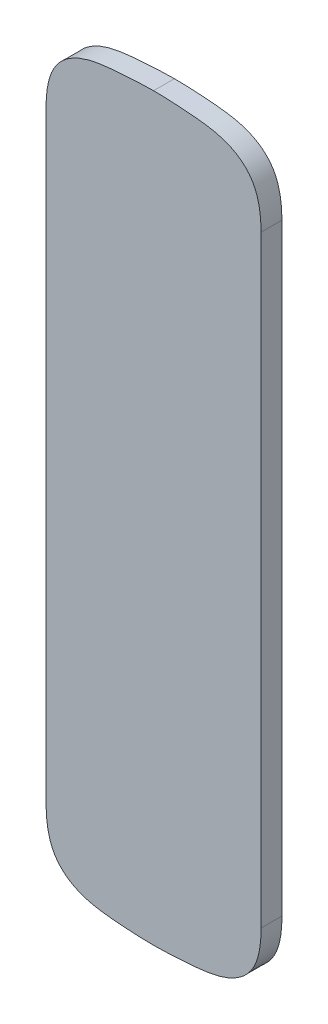
ISO-10303-21;
HEADER;
FILE_DESCRIPTION(('STEP AP214'),'2;1');
FILE_NAME('part.step','',(''),(''),'','','');
FILE_SCHEMA(('AUTOMOTIVE_DESIGN { 1 0 10303 214 1 1 1 1 }'));
ENDSEC;
DATA;
#1=APPLICATION_CONTEXT('core data for automotive mechanical design processes');
#2=APPLICATION_PROTOCOL_DEFINITION('international standard','automotive_design',2000,#1);
#3=PRODUCT_CONTEXT('',#1,'mechanical');
#4=PRODUCT('Part','Part','',(#3));
#5=PRODUCT_RELATED_PRODUCT_CATEGORY('part','',(#4));
#6=PRODUCT_DEFINITION_FORMATION('','',#4);
#7=PRODUCT_DEFINITION_CONTEXT('part definition',#1,'design');
#8=PRODUCT_DEFINITION('design','',#6,#7);
#9=PRODUCT_DEFINITION_SHAPE('','',#8);
#10=(LENGTH_UNIT() NAMED_UNIT(*) SI_UNIT(.MILLI.,.METRE.));
#11=(NAMED_UNIT(*) PLANE_ANGLE_UNIT() SI_UNIT($,.RADIAN.));
#12=(NAMED_UNIT(*) SI_UNIT($,.STERADIAN.) SOLID_ANGLE_UNIT());
#13=UNCERTAINTY_MEASURE_WITH_UNIT(LENGTH_MEASURE(1.E-05),#10,'distance_accuracy_value','');
#14=(GEOMETRIC_REPRESENTATION_CONTEXT(3) GLOBAL_UNCERTAINTY_ASSIGNED_CONTEXT((#13)) GLOBAL_UNIT_ASSIGNED_CONTEXT((#10,
#11,#12)) REPRESENTATION_CONTEXT('',''));
#15=CARTESIAN_POINT('',(0.,0.,0.));
#16=DIRECTION('',(0.,0.,1.));
#17=DIRECTION('',(1.,0.,0.));
#18=AXIS2_PLACEMENT_3D('',#15,#16,#17);
#19=CARTESIAN_POINT('',(-5.4291183451582E-08,-20.0991173996894,1.));
#20=CARTESIAN_POINT('',(-0.156548330044812,-20.0991002312867,1.));
#21=CARTESIAN_POINT('',(-0.477806463037724,-20.1046537362703,1.));
#22=CARTESIAN_POINT('',(-1.05453599530889,-20.1324012711107,1.));
#23=CARTESIAN_POINT('',(-2.09618649112654,-20.202022658311,1.));
#24=CARTESIAN_POINT('',(-3.30992929589353,-20.3388223341729,1.));
#25=CARTESIAN_POINT('',(-4.34561614727652,-20.9380708553145,1.));
#26=CARTESIAN_POINT('',(-4.88362330268929,-21.6285429751254,1.));
#27=CARTESIAN_POINT('',(-5.12194624719199,-22.5108076481464,1.));
#28=CARTESIAN_POINT('',(-5.15651306574814,-23.099976493431,1.));
#29=CARTESIAN_POINT('',(-5.15651306585172,-23.3956530777047,1.));
#30=B_SPLINE_CURVE_WITH_KNOTS('',3,(#19,#20,#21,#22,#23,#24,#25,#26,#27,#28,#29),.UNSPECIFIED.,
.F.,.F.,(4,1,1,1,1,1,1,1,4),(-1.38448489454635E-06,0.0624987020454114,0.124998788575717,
0.249998961636329,0.499999307757553,0.624999480818164,0.749999653878776,0.874999826939388,1.),.UNSPECIFIED.);
#31=DIRECTION('',(0.,0.,-1.));
#32=VECTOR('',#31,1.);
#33=SURFACE_OF_LINEAR_EXTRUSION('',#30,#32);
#34=CARTESIAN_POINT('',(-5.4291183451582E-08,-20.0991173996894,0.));
#35=CARTESIAN_POINT('',(-0.156548330044812,-20.0991002312867,0.));
#36=CARTESIAN_POINT('',(-0.477806463037724,-20.1046537362703,0.));
#37=CARTESIAN_POINT('',(-1.05453599530889,-20.1324012711107,0.));
#38=CARTESIAN_POINT('',(-2.09618649112654,-20.202022658311,0.));
#39=CARTESIAN_POINT('',(-3.30992929589353,-20.3388223341729,0.));
#40=CARTESIAN_POINT('',(-4.34561614727652,-20.9380708553145,0.));
#41=CARTESIAN_POINT('',(-4.88362330268929,-21.6285429751254,0.));
#42=CARTESIAN_POINT('',(-5.12194624719199,-22.5108076481464,0.));
#43=CARTESIAN_POINT('',(-5.15651306574814,-23.099976493431,0.));
#44=CARTESIAN_POINT('',(-5.15651306585172,-23.3956530777047,0.));
#45=B_SPLINE_CURVE_WITH_KNOTS('',3,(#34,#35,#36,#37,#38,#39,#40,#41,#42,#43,#44),.UNSPECIFIED.,
.F.,.F.,(4,1,1,1,1,1,1,1,4),(-1.38448489454635E-06,0.0624987020454114,0.124998788575717,
0.249998961636329,0.499999307757553,0.624999480818164,0.749999653878776,0.874999826939388,1.),.UNSPECIFIED.);
#46=CARTESIAN_POINT('',(-5.42911842912713E-08,-20.0991173996894,0.));
#47=VERTEX_POINT('',#46);
#48=CARTESIAN_POINT('',(-5.15651306585172,-23.3956530777047,0.));
#49=VERTEX_POINT('',#48);
#50=EDGE_CURVE('E124',#47,#49,#45,.T.);
#51=ORIENTED_EDGE('',*,*,#50,.T.);
#52=DIRECTION('',(0.,0.,-1.));
#53=VECTOR('',#52,1.);
#54=CARTESIAN_POINT('',(-5.15651306585172,-23.3956530777047,1.));
#55=LINE('',#54,#53);
#56=CARTESIAN_POINT('',(-5.15651306585172,-23.3956530777047,1.));
#57=VERTEX_POINT('',#56);
#58=EDGE_CURVE('E11',#57,#49,#55,.T.);
#59=ORIENTED_EDGE('',*,*,#58,.F.);
#60=CARTESIAN_POINT('',(-5.42911842912713E-08,-20.0991173996894,1.));
#61=VERTEX_POINT('',#60);
#62=EDGE_CURVE('E153',#61,#57,#30,.T.);
#63=ORIENTED_EDGE('',*,*,#62,.F.);
#64=DIRECTION('',(0.,0.,-1.));
#65=VECTOR('',#64,1.);
#66=CARTESIAN_POINT('',(-5.42911842912713E-08,-20.0991173996894,1.));
#67=LINE('',#66,#65);
#68=EDGE_CURVE('E114',#61,#47,#67,.T.);
#69=ORIENTED_EDGE('',*,*,#68,.T.);
#70=EDGE_LOOP('',(#51,#59,#63,#69));
#71=FACE_BOUND('',#70,.T.);
#72=ADVANCED_FACE('F33',(#71),#33,.F.);
#73=CARTESIAN_POINT('',(-5.15651306585172,-23.3956530777047,1.));
#74=DIRECTION('',(1.,-3.50327577902706E-10,0.));
#75=DIRECTION('',(3.50327577902706E-10,1.,0.));
#76=AXIS2_PLACEMENT_3D('',#73,#74,#75);
#77=PLANE('',#76);
#78=DIRECTION('',(-3.50327577902706E-10,-1.,0.));
#79=VECTOR('',#78,1.);
#80=CARTESIAN_POINT('',(-5.15651306585172,-23.3956530777047,0.));
#81=LINE('',#80,#79);
#82=CARTESIAN_POINT('',(-5.15651307597643,-52.2963469902562,0.));
#83=VERTEX_POINT('',#82);
#84=EDGE_CURVE('E178',#49,#83,#81,.T.);
#85=ORIENTED_EDGE('',*,*,#84,.T.);
#86=DIRECTION('',(0.,0.,-1.));
#87=VECTOR('',#86,1.);
#88=CARTESIAN_POINT('',(-5.15651307597643,-52.2963469902562,1.));
#89=LINE('',#88,#87);
#90=CARTESIAN_POINT('',(-5.15651307597643,-52.2963469902562,1.));
#91=VERTEX_POINT('',#90);
#92=EDGE_CURVE('E42',#91,#83,#89,.T.);
#93=ORIENTED_EDGE('',*,*,#92,.F.);
#94=DIRECTION('',(-3.50327577902706E-10,-1.,0.));
#95=VECTOR('',#94,1.);
#96=CARTESIAN_POINT('',(-5.15651306585172,-23.3956530777047,1.));
#97=LINE('',#96,#95);
#98=EDGE_CURVE('E87',#57,#91,#97,.T.);
#99=ORIENTED_EDGE('',*,*,#98,.F.);
#100=ORIENTED_EDGE('',*,*,#58,.T.);
#101=EDGE_LOOP('',(#85,#93,#99,#100));
#102=FACE_BOUND('',#101,.T.);
#103=ADVANCED_FACE('F144',(#102),#77,.F.);
#104=CARTESIAN_POINT('',(-5.15651307597643,-52.2963469902562,1.));
#105=CARTESIAN_POINT('',(-5.15651307608001,-52.592023574531,1.));
#106=CARTESIAN_POINT('',(-5.12194625793638,-53.1811924198423,1.));
#107=CARTESIAN_POINT('',(-4.88362331404969,-54.0634570930333,1.));
#108=CARTESIAN_POINT('',(-4.34561615911523,-54.7539292132218,1.));
#109=CARTESIAN_POINT('',(-3.30992930814552,-55.3531777350864,1.));
#110=CARTESIAN_POINT('',(-2.0961865034679,-55.4899774117957,1.));
#111=CARTESIAN_POINT('',(-1.05453600769688,-55.5595987997258,1.));
#112=CARTESIAN_POINT('',(-0.477806475442199,-55.5873463349699,1.));
#113=CARTESIAN_POINT('',(-0.156548342449667,-55.5928998401774,1.));
#114=CARTESIAN_POINT('',(-6.66945320573583E-08,-55.5928826718844,1.));
#115=B_SPLINE_CURVE_WITH_KNOTS('',3,(#104,#105,#106,#107,#108,#109,#110,#111,#112,#113,#114),
.UNSPECIFIED.,.F.,.F.,(4,1,1,1,1,1,1,1,4),(0.,0.125000173061102,0.250000346122205,
0.375000519183307,0.50000069224441,0.750001038366615,0.875001211427717,0.937501297958269,
1.00000138448882),.UNSPECIFIED.);
#116=DIRECTION('',(0.,0.,-1.));
#117=VECTOR('',#116,1.);
#118=SURFACE_OF_LINEAR_EXTRUSION('',#115,#117);
#119=CARTESIAN_POINT('',(-5.15651307597643,-52.2963469902562,0.));
#120=CARTESIAN_POINT('',(-5.15651307608001,-52.592023574531,0.));
#121=CARTESIAN_POINT('',(-5.12194625793638,-53.1811924198423,0.));
#122=CARTESIAN_POINT('',(-4.88362331404969,-54.0634570930333,0.));
#123=CARTESIAN_POINT('',(-4.34561615911523,-54.7539292132218,0.));
#124=CARTESIAN_POINT('',(-3.30992930814552,-55.3531777350864,0.));
#125=CARTESIAN_POINT('',(-2.0961865034679,-55.4899774117957,0.));
#126=CARTESIAN_POINT('',(-1.05453600769688,-55.5595987997258,0.));
#127=CARTESIAN_POINT('',(-0.477806475442199,-55.5873463349699,0.));
#128=CARTESIAN_POINT('',(-0.156548342449667,-55.5928998401774,0.));
#129=CARTESIAN_POINT('',(-6.66945320573583E-08,-55.5928826718844,0.));
#130=B_SPLINE_CURVE_WITH_KNOTS('',3,(#119,#120,#121,#122,#123,#124,#125,#126,#127,#128,#129),
.UNSPECIFIED.,.F.,.F.,(4,1,1,1,1,1,1,1,4),(0.,0.125000173061102,0.250000346122205,
0.375000519183307,0.50000069224441,0.750001038366615,0.875001211427717,0.937501297958269,
1.00000138448882),.UNSPECIFIED.);
#131=CARTESIAN_POINT('',(-6.66945320573583E-08,-55.5928826718844,0.));
#132=VERTEX_POINT('',#131);
#133=EDGE_CURVE('E175',#83,#132,#130,.T.);
#134=ORIENTED_EDGE('',*,*,#133,.T.);
#135=DIRECTION('',(0.,0.,-1.));
#136=VECTOR('',#135,1.);
#137=CARTESIAN_POINT('',(-6.66945320573583E-08,-55.5928826718844,1.));
#138=LINE('',#137,#136);
#139=CARTESIAN_POINT('',(-6.66945320573583E-08,-55.5928826718844,1.));
#140=VERTEX_POINT('',#139);
#141=EDGE_CURVE('E109',#140,#132,#138,.T.);
#142=ORIENTED_EDGE('',*,*,#141,.F.);
#143=EDGE_CURVE('E100',#91,#140,#115,.T.);
#144=ORIENTED_EDGE('',*,*,#143,.F.);
#145=ORIENTED_EDGE('',*,*,#92,.T.);
#146=EDGE_LOOP('',(#134,#142,#144,#145));
#147=FACE_BOUND('',#146,.T.);
#148=ADVANCED_FACE('F142',(#147),#118,.F.);
#149=CARTESIAN_POINT('',(-6.66945327139196E-08,-55.5928826718844,1.));
#150=CARTESIAN_POINT('',(0.15654820905615,-55.5928998402871,1.));
#151=CARTESIAN_POINT('',(0.477806342042139,-55.5873463353014,1.));
#152=CARTESIAN_POINT('',(1.05453587430747,-55.5595988004603,1.));
#153=CARTESIAN_POINT('',(2.09618637012088,-55.4899774132596,1.));
#154=CARTESIAN_POINT('',(3.3099291748751,-55.3531777373918,1.));
#155=CARTESIAN_POINT('',(4.34561602624509,-54.7539292162453,1.));
#156=CARTESIAN_POINT('',(4.88362318164704,-54.0634570964355,1.));
#157=CARTESIAN_POINT('',(5.12194612614549,-53.1811924234203,1.));
#158=CARTESIAN_POINT('',(5.15651294470107,-52.5920235781405,1.));
#159=CARTESIAN_POINT('',(5.15651294480465,-52.2963469938692,1.));
#160=B_SPLINE_CURVE_WITH_KNOTS('',3,(#149,#150,#151,#152,#153,#154,#155,#156,#157,#158,#159),
.UNSPECIFIED.,.F.,.F.,(4,1,1,1,1,1,1,1,4),(-1.38447714943881E-06,0.0624987020526724,
0.124998788582494,0.249998961642138,0.499999307761425,0.624999480821069,0.749999653880713,
0.874999826940356,1.),.UNSPECIFIED.);
#161=DIRECTION('',(0.,0.,-1.));
#162=VECTOR('',#161,1.);
#163=SURFACE_OF_LINEAR_EXTRUSION('',#160,#162);
#164=CARTESIAN_POINT('',(-6.66945327139196E-08,-55.5928826718844,0.));
#165=CARTESIAN_POINT('',(0.15654820905615,-55.5928998402871,0.));
#166=CARTESIAN_POINT('',(0.477806342042139,-55.5873463353014,0.));
#167=CARTESIAN_POINT('',(1.05453587430747,-55.5595988004603,0.));
#168=CARTESIAN_POINT('',(2.09618637012088,-55.4899774132596,0.));
#169=CARTESIAN_POINT('',(3.3099291748751,-55.3531777373918,0.));
#170=CARTESIAN_POINT('',(4.34561602624509,-54.7539292162453,0.));
#171=CARTESIAN_POINT('',(4.88362318164704,-54.0634570964355,0.));
#172=CARTESIAN_POINT('',(5.12194612614549,-53.1811924234203,0.));
#173=CARTESIAN_POINT('',(5.15651294470107,-52.5920235781405,0.));
#174=CARTESIAN_POINT('',(5.15651294480465,-52.2963469938692,0.));
#175=B_SPLINE_CURVE_WITH_KNOTS('',3,(#164,#165,#166,#167,#168,#169,#170,#171,#172,#173,#174),
.UNSPECIFIED.,.F.,.F.,(4,1,1,1,1,1,1,1,4),(-1.38447714943881E-06,0.0624987020526724,
0.124998788582494,0.249998961642138,0.499999307761425,0.624999480821069,0.749999653880713,
0.874999826940356,1.),.UNSPECIFIED.);
#176=CARTESIAN_POINT('',(5.15651294480465,-52.2963469938692,0.));
#177=VERTEX_POINT('',#176);
#178=EDGE_CURVE('E108',#132,#177,#175,.T.);
#179=ORIENTED_EDGE('',*,*,#178,.T.);
#180=DIRECTION('',(0.,0.,-1.));
#181=VECTOR('',#180,1.);
#182=CARTESIAN_POINT('',(5.15651294480465,-52.2963469938692,1.));
#183=LINE('',#182,#181);
#184=CARTESIAN_POINT('',(5.15651294480465,-52.2963469938692,1.));
#185=VERTEX_POINT('',#184);
#186=EDGE_CURVE('E105',#185,#177,#183,.T.);
#187=ORIENTED_EDGE('',*,*,#186,.F.);
#188=EDGE_CURVE('E94',#140,#185,#160,.T.);
#189=ORIENTED_EDGE('',*,*,#188,.F.);
#190=ORIENTED_EDGE('',*,*,#141,.T.);
#191=EDGE_LOOP('',(#179,#187,#189,#190));
#192=FACE_BOUND('',#191,.T.);
#193=ADVANCED_FACE('F106',(#192),#163,.F.);
#194=CARTESIAN_POINT('',(5.15651294480465,-52.2963469938692,1.));
#195=DIRECTION('',(-1.,3.50327457855521E-10,0.));
#196=DIRECTION('',(-3.50327457855521E-10,-1.,0.));
#197=AXIS2_PLACEMENT_3D('',#194,#195,#196);
#198=PLANE('',#197);
#199=DIRECTION('',(3.50327457855521E-10,1.,0.));
#200=VECTOR('',#199,1.);
#201=CARTESIAN_POINT('',(5.15651294480465,-52.2963469938692,0.));
#202=LINE('',#201,#200);
#203=CARTESIAN_POINT('',(5.15651295492936,-23.3956530813176,0.));
#204=VERTEX_POINT('',#203);
#205=EDGE_CURVE('E73',#177,#204,#202,.T.);
#206=ORIENTED_EDGE('',*,*,#205,.T.);
#207=DIRECTION('',(0.,0.,-1.));
#208=VECTOR('',#207,1.);
#209=CARTESIAN_POINT('',(5.15651295492936,-23.3956530813176,1.));
#210=LINE('',#209,#208);
#211=CARTESIAN_POINT('',(5.15651295492936,-23.3956530813176,1.));
#212=VERTEX_POINT('',#211);
#213=EDGE_CURVE('E110',#212,#204,#210,.T.);
#214=ORIENTED_EDGE('',*,*,#213,.F.);
#215=DIRECTION('',(3.50327457855521E-10,1.,0.));
#216=VECTOR('',#215,1.);
#217=CARTESIAN_POINT('',(5.15651294480465,-52.2963469938692,1.));
#218=LINE('',#217,#216);
#219=EDGE_CURVE('E98',#185,#212,#218,.T.);
#220=ORIENTED_EDGE('',*,*,#219,.F.);
#221=ORIENTED_EDGE('',*,*,#186,.T.);
#222=EDGE_LOOP('',(#206,#214,#220,#221));
#223=FACE_BOUND('',#222,.T.);
#224=ADVANCED_FACE('F112',(#223),#198,.F.);
#225=CARTESIAN_POINT('',(5.15651295492936,-23.3956530813176,1.));
#226=CARTESIAN_POINT('',(5.15651295503294,-23.0999764970451,1.));
#227=CARTESIAN_POINT('',(5.12194613688988,-22.5108076517387,1.));
#228=CARTESIAN_POINT('',(4.88362319300744,-21.6285429785535,1.));
#229=CARTESIAN_POINT('',(4.34561603808379,-20.9380708583662,1.));
#230=CARTESIAN_POINT('',(3.30992918712707,-20.3388223364966,1.));
#231=CARTESIAN_POINT('',(2.09618638246223,-20.2020226597813,1.));
#232=CARTESIAN_POINT('',(1.05453588669546,-20.1324012718509,1.));
#233=CARTESIAN_POINT('',(0.477806354446608,-20.1046537366061,1.));
#234=CARTESIAN_POINT('',(0.156548221461003,-20.0991002313964,1.));
#235=CARTESIAN_POINT('',(-5.42911842912713E-08,-20.0991173996894,1.));
#236=B_SPLINE_CURVE_WITH_KNOTS('',3,(#225,#226,#227,#228,#229,#230,#231,#232,#233,#234,#235),
.UNSPECIFIED.,.F.,.F.,(4,1,1,1,1,1,1,1,4),(0.,0.125000173060134,0.250000346120269,
0.375000519180403,0.500000692240537,0.750001038360806,0.875001211420941,0.937501297951008,
1.00000138448107),.UNSPECIFIED.);
#237=DIRECTION('',(0.,0.,-1.));
#238=VECTOR('',#237,1.);
#239=SURFACE_OF_LINEAR_EXTRUSION('',#236,#238);
#240=CARTESIAN_POINT('',(5.15651295492936,-23.3956530813176,0.));
#241=CARTESIAN_POINT('',(5.15651295503294,-23.0999764970451,0.));
#242=CARTESIAN_POINT('',(5.12194613688988,-22.5108076517387,0.));
#243=CARTESIAN_POINT('',(4.88362319300744,-21.6285429785535,0.));
#244=CARTESIAN_POINT('',(4.34561603808379,-20.9380708583662,0.));
#245=CARTESIAN_POINT('',(3.30992918712707,-20.3388223364966,0.));
#246=CARTESIAN_POINT('',(2.09618638246223,-20.2020226597813,0.));
#247=CARTESIAN_POINT('',(1.05453588669546,-20.1324012718509,0.));
#248=CARTESIAN_POINT('',(0.477806354446608,-20.1046537366061,0.));
#249=CARTESIAN_POINT('',(0.156548221461003,-20.0991002313964,0.));
#250=CARTESIAN_POINT('',(-5.42911842912713E-08,-20.0991173996894,0.));
#251=B_SPLINE_CURVE_WITH_KNOTS('',3,(#240,#241,#242,#243,#244,#245,#246,#247,#248,#249,#250),
.UNSPECIFIED.,.F.,.F.,(4,1,1,1,1,1,1,1,4),(0.,0.125000173060134,0.250000346120269,
0.375000519180403,0.500000692240537,0.750001038360806,0.875001211420941,0.937501297951008,
1.00000138448107),.UNSPECIFIED.);
#252=EDGE_CURVE('E79',#204,#47,#251,.T.);
#253=ORIENTED_EDGE('',*,*,#252,.T.);
#254=ORIENTED_EDGE('',*,*,#68,.F.);
#255=EDGE_CURVE('E50',#212,#61,#236,.T.);
#256=ORIENTED_EDGE('',*,*,#255,.F.);
#257=ORIENTED_EDGE('',*,*,#213,.T.);
#258=EDGE_LOOP('',(#253,#254,#256,#257));
#259=FACE_BOUND('',#258,.T.);
#260=ADVANCED_FACE('F132',(#259),#239,.F.);
#261=CARTESIAN_POINT('',(-3.55401301262395,-20.5271718682316,1.));
#262=DIRECTION('',(0.,0.,-1.));
#263=DIRECTION('',(-1.,0.,0.));
#264=AXIS2_PLACEMENT_3D('',#261,#262,#263);
#265=PLANE('',#264);
#266=ORIENTED_EDGE('',*,*,#62,.T.);
#267=ORIENTED_EDGE('',*,*,#98,.T.);
#268=ORIENTED_EDGE('',*,*,#143,.T.);
#269=ORIENTED_EDGE('',*,*,#188,.T.);
#270=ORIENTED_EDGE('',*,*,#219,.T.);
#271=ORIENTED_EDGE('',*,*,#255,.T.);
#272=EDGE_LOOP('',(#266,#267,#268,#269,#270,#271));
#273=FACE_BOUND('',#272,.T.);
#274=ADVANCED_FACE('F96',(#273),#265,.F.);
#275=CARTESIAN_POINT('',(-3.55401301262395,-20.5271718682316,0.));
#276=DIRECTION('',(0.,0.,-1.));
#277=DIRECTION('',(-1.,0.,0.));
#278=AXIS2_PLACEMENT_3D('',#275,#276,#277);
#279=PLANE('',#278);
#280=ORIENTED_EDGE('',*,*,#50,.F.);
#281=ORIENTED_EDGE('',*,*,#252,.F.);
#282=ORIENTED_EDGE('',*,*,#205,.F.);
#283=ORIENTED_EDGE('',*,*,#178,.F.);
#284=ORIENTED_EDGE('',*,*,#133,.F.);
#285=ORIENTED_EDGE('',*,*,#84,.F.);
#286=EDGE_LOOP('',(#280,#281,#282,#283,#284,#285));
#287=FACE_BOUND('',#286,.T.);
#288=ADVANCED_FACE('F136',(#287),#279,.T.);
#289=CLOSED_SHELL('',(#72,#103,#148,#193,#224,#260,#274,#288));
#290=MANIFOLD_SOLID_BREP('B2',#289);
#291=ADVANCED_BREP_SHAPE_REPRESENTATION('',(#18,#290),#14);
#292=SHAPE_DEFINITION_REPRESENTATION(#9,#291);
ENDSEC;
END-ISO-10303-21;
